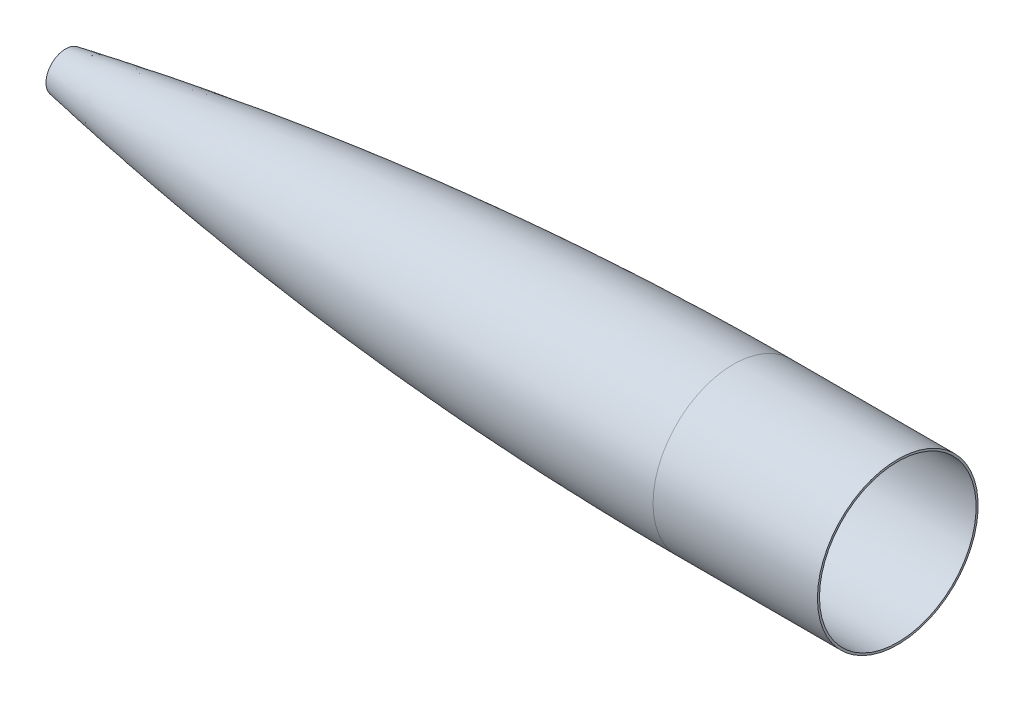
ISO-10303-21;
HEADER;
FILE_DESCRIPTION(('STEP AP214'),'2;1');
FILE_NAME('part.step','',(''),(''),'','','');
FILE_SCHEMA(('AUTOMOTIVE_DESIGN { 1 0 10303 214 1 1 1 1 }'));
ENDSEC;
DATA;
#1=APPLICATION_CONTEXT('core data for automotive mechanical design processes');
#2=APPLICATION_PROTOCOL_DEFINITION('international standard','automotive_design',2000,#1);
#3=PRODUCT_CONTEXT('',#1,'mechanical');
#4=PRODUCT('Part','Part','',(#3));
#5=PRODUCT_RELATED_PRODUCT_CATEGORY('part','',(#4));
#6=PRODUCT_DEFINITION_FORMATION('','',#4);
#7=PRODUCT_DEFINITION_CONTEXT('part definition',#1,'design');
#8=PRODUCT_DEFINITION('design','',#6,#7);
#9=PRODUCT_DEFINITION_SHAPE('','',#8);
#10=(LENGTH_UNIT() NAMED_UNIT(*) SI_UNIT(.MILLI.,.METRE.));
#11=(NAMED_UNIT(*) PLANE_ANGLE_UNIT() SI_UNIT($,.RADIAN.));
#12=(NAMED_UNIT(*) SI_UNIT($,.STERADIAN.) SOLID_ANGLE_UNIT());
#13=UNCERTAINTY_MEASURE_WITH_UNIT(LENGTH_MEASURE(1.E-05),#10,'distance_accuracy_value','');
#14=(GEOMETRIC_REPRESENTATION_CONTEXT(3) GLOBAL_UNCERTAINTY_ASSIGNED_CONTEXT((#13)) GLOBAL_UNIT_ASSIGNED_CONTEXT((#10,
#11,#12)) REPRESENTATION_CONTEXT('',''));
#15=CARTESIAN_POINT('',(0.,0.,0.));
#16=DIRECTION('',(0.,0.,1.));
#17=DIRECTION('',(1.,0.,0.));
#18=AXIS2_PLACEMENT_3D('',#15,#16,#17);
#19=CARTESIAN_POINT('',(749.94176676177,78.2000000001766,0.));
#20=CARTESIAN_POINT('',(749.013447521929,78.1990821646957,0.));
#21=CARTESIAN_POINT('',(747.142871411381,78.1963244631353,0.));
#22=CARTESIAN_POINT('',(743.144962511508,78.1882845770281,0.));
#23=CARTESIAN_POINT('',(738.792712605825,78.1730824819712,0.));
#24=CARTESIAN_POINT('',(734.382362932978,78.1523734655628,0.));
#25=CARTESIAN_POINT('',(729.905925646213,78.1261496546705,0.));
#26=CARTESIAN_POINT('',(725.461793245013,78.0945083632932,0.));
#27=CARTESIAN_POINT('',(721.009948114807,78.0574100665878,0.));
#28=CARTESIAN_POINT('',(717.103075526994,78.0200644610595,0.));
#29=CARTESIAN_POINT('',(713.74042464985,77.9844742097373,0.));
#30=CARTESIAN_POINT('',(710.353297221346,77.945829443464,0.));
#31=CARTESIAN_POINT('',(705.804444354857,77.8901355328951,0.));
#32=CARTESIAN_POINT('',(692.726759228616,77.7109242706275,0.));
#33=CARTESIAN_POINT('',(668.847358903374,77.2741042149261,0.));
#34=CARTESIAN_POINT('',(589.263170065417,75.1540746430687,0.));
#35=CARTESIAN_POINT('',(489.305434179286,69.6517508511253,0.));
#36=CARTESIAN_POINT('',(389.580060838768,60.8164215796509,0.));
#37=CARTESIAN_POINT('',(294.739285061992,49.2944245859872,0.));
#38=CARTESIAN_POINT('',(254.169064402329,43.7807815468403,0.));
#39=CARTESIAN_POINT('',(233.90294519789,40.8886698765213,0.));
#40=CARTESIAN_POINT('',(220.400428697888,38.9042715903934,0.));
#41=CARTESIAN_POINT('',(211.402067612572,37.5588123649427,0.));
#42=CARTESIAN_POINT('',(202.407139457551,36.1908454960505,0.));
#43=CARTESIAN_POINT('',(193.415599848764,34.8003611466702,0.));
#44=CARTESIAN_POINT('',(184.427673470814,33.387398792785,0.));
#45=CARTESIAN_POINT('',(175.443135341572,31.9519158863388,0.));
#46=CARTESIAN_POINT('',(166.462511860041,30.4940073264908,0.));
#47=CARTESIAN_POINT('',(157.485070561983,29.0135381195667,0.));
#48=CARTESIAN_POINT('',(148.512205564119,27.510762016555,0.));
#49=CARTESIAN_POINT('',(139.589972430126,25.9934811764236,0.));
#50=CARTESIAN_POINT('',(131.819133927516,24.6521565582264,0.));
#51=CARTESIAN_POINT('',(125.190409798549,23.4938734154169,0.));
#52=CARTESIAN_POINT('',(119.719521427806,22.5287764747113,0.));
#53=CARTESIAN_POINT('',(115.861710290932,21.8432102645428,0.));
#54=CARTESIAN_POINT('',(112.599803599681,21.2603041964968,0.));
#55=CARTESIAN_POINT('',(109.362490043085,20.6791222894646,0.));
#56=CARTESIAN_POINT('',(106.033221561676,20.0783671859564,0.));
#57=CARTESIAN_POINT('',(102.753257436666,19.4824668915702,0.));
#58=CARTESIAN_POINT('',(100.913198246995,19.1471478705529,0.));
#59=CARTESIAN_POINT('',(99.9999999999461,18.9802750382021,0.));
#60=B_SPLINE_CURVE_WITH_KNOTS('',4,(#19,#20,#21,#22,#23,#24,#25,#26,#27,#28,#29,#30,#31,#32,#33,
#34,#35,#36,#37,#38,#39,#40,#41,#42,#43,#44,#45,#46,#47,#48,#49,#50,#51,#52,#53,#54,#55,#56,#57,
#58,#59),.UNSPECIFIED.,.F.,.F.,(5,1,1,1,1,1,1,1,1,1,1,1,1,1,1,1,1,1,1,1,1,1,1,1,1,1,1,1,1,1,1,1,
1,1,1,1,1,5),(0.0827856324898364,0.0884676550262897,0.0941496775627431,0.0998317000991964,
0.10551372263565,0.111195745172103,0.116877767708556,0.12255979024501,0.128241812781463,
0.131145416719654,0.134049020657844,0.139856228534224,0.151470644286985,0.197928307106307,
0.256000385898297,0.546360778357468,0.662504935945017,0.7089625992743,0.743805846549275,
0.755420262183219,0.767034677817164,0.778649093451108,0.790263508968603,0.801877924486097,
0.813492340003591,0.825106755521085,0.836721171093262,0.848335586665439,0.859950002237616,
0.871564417809793,0.882928463715115,0.888610486667776,0.894292509620437,0.899974532573098,
0.902815544049428,0.905656555525759,0.91133857847842,0.917020601431081),.UNSPECIFIED.);
#61=CARTESIAN_POINT('',(0.,0.,0.));
#62=DIRECTION('',(-1.,0.,0.));
#63=AXIS1_PLACEMENT('',#61,#62);
#64=SURFACE_OF_REVOLUTION('',#60,#63);
#65=CARTESIAN_POINT('',(100.,0.,0.));
#66=DIRECTION('',(-1.,0.,0.));
#67=DIRECTION('',(0.,0.,1.));
#68=AXIS2_PLACEMENT_3D('',#65,#66,#67);
#69=CIRCLE('',#68,18.9802750382119);
#70=CARTESIAN_POINT('',(100.,0.,18.9802750382119));
#71=VERTEX_POINT('',#70);
#72=EDGE_CURVE('E10',#71,#71,#69,.T.);
#73=ORIENTED_EDGE('',*,*,#72,.F.);
#74=EDGE_LOOP('',(#73));
#75=FACE_BOUND('',#74,.T.);
#76=CARTESIAN_POINT('',(749.941766761772,0.,0.));
#77=DIRECTION('',(-1.,0.,0.));
#78=DIRECTION('',(0.,0.,1.));
#79=AXIS2_PLACEMENT_3D('',#76,#77,#78);
#80=CIRCLE('',#79,78.2000000001716);
#81=CARTESIAN_POINT('',(749.941766761772,0.,78.2000000001716));
#82=VERTEX_POINT('',#81);
#83=EDGE_CURVE('E50',#82,#82,#80,.T.);
#84=ORIENTED_EDGE('',*,*,#83,.T.);
#85=EDGE_LOOP('',(#84));
#86=FACE_BOUND('',#85,.T.);
#87=ADVANCED_FACE('F37',(#75,#86),#64,.T.);
#88=CARTESIAN_POINT('',(100.,18.9802750382119,0.));
#89=DIRECTION('',(1.,0.,0.));
#90=DIRECTION('',(0.,0.,-1.));
#91=AXIS2_PLACEMENT_3D('',#88,#89,#90);
#92=PLANE('',#91);
#93=ORIENTED_EDGE('',*,*,#72,.T.);
#94=EDGE_LOOP('',(#93));
#95=FACE_BOUND('',#94,.T.);
#96=ADVANCED_FACE('F39',(#95),#92,.F.);
#97=CARTESIAN_POINT('',(909.941766761772,78.2000000001716,0.));
#98=DIRECTION('',(-1.,0.,0.));
#99=DIRECTION('',(0.,0.,1.));
#100=AXIS2_PLACEMENT_3D('',#97,#98,#99);
#101=PLANE('',#100);
#102=CARTESIAN_POINT('',(909.941766761772,0.,0.));
#103=DIRECTION('',(-1.,0.,0.));
#104=DIRECTION('',(0.,0.,1.));
#105=AXIS2_PLACEMENT_3D('',#102,#103,#104);
#106=CIRCLE('',#105,76.2000000001716);
#107=CARTESIAN_POINT('',(909.941766761772,0.,76.2000000001716));
#108=VERTEX_POINT('',#107);
#109=EDGE_CURVE('E58',#108,#108,#106,.T.);
#110=ORIENTED_EDGE('',*,*,#109,.T.);
#111=EDGE_LOOP('',(#110));
#112=FACE_BOUND('',#111,.T.);
#113=CARTESIAN_POINT('',(909.941766761772,0.,0.));
#114=DIRECTION('',(-1.,0.,0.));
#115=DIRECTION('',(0.,0.,1.));
#116=AXIS2_PLACEMENT_3D('',#113,#114,#115);
#117=CIRCLE('',#116,78.2000000001716);
#118=CARTESIAN_POINT('',(909.941766761772,0.,78.2000000001716));
#119=VERTEX_POINT('',#118);
#120=EDGE_CURVE('E45',#119,#119,#117,.T.);
#121=ORIENTED_EDGE('',*,*,#120,.F.);
#122=EDGE_LOOP('',(#121));
#123=FACE_BOUND('',#122,.T.);
#124=ADVANCED_FACE('F89',(#112,#123),#101,.F.);
#125=CARTESIAN_POINT('',(0.,0.,0.));
#126=DIRECTION('',(-1.,0.,0.));
#127=DIRECTION('',(0.,0.,1.));
#128=AXIS2_PLACEMENT_3D('',#125,#126,#127);
#129=CYLINDRICAL_SURFACE('',#128,78.2000000001716);
#130=ORIENTED_EDGE('',*,*,#83,.F.);
#131=EDGE_LOOP('',(#130));
#132=FACE_BOUND('',#131,.T.);
#133=ORIENTED_EDGE('',*,*,#120,.T.);
#134=EDGE_LOOP('',(#133));
#135=FACE_BOUND('',#134,.T.);
#136=ADVANCED_FACE('F87',(#132,#135),#129,.T.);
#137=CARTESIAN_POINT('',(749.94176676177,78.2000000001766,0.));
#138=CARTESIAN_POINT('',(749.013447521929,78.1990821646957,0.));
#139=CARTESIAN_POINT('',(747.142871411381,78.1963244631353,0.));
#140=CARTESIAN_POINT('',(743.144962511508,78.1882845770281,0.));
#141=CARTESIAN_POINT('',(738.792712605825,78.1730824819712,0.));
#142=CARTESIAN_POINT('',(734.382362932978,78.1523734655628,0.));
#143=CARTESIAN_POINT('',(729.905925646213,78.1261496546705,0.));
#144=CARTESIAN_POINT('',(725.461793245013,78.0945083632932,0.));
#145=CARTESIAN_POINT('',(721.009948114807,78.0574100665878,0.));
#146=CARTESIAN_POINT('',(717.103075526994,78.0200644610595,0.));
#147=CARTESIAN_POINT('',(713.74042464985,77.9844742097373,0.));
#148=CARTESIAN_POINT('',(710.353297221346,77.945829443464,0.));
#149=CARTESIAN_POINT('',(705.804444354857,77.8901355328951,0.));
#150=CARTESIAN_POINT('',(692.726759228616,77.7109242706275,0.));
#151=CARTESIAN_POINT('',(668.847358903374,77.2741042149261,0.));
#152=CARTESIAN_POINT('',(589.263170065417,75.1540746430687,0.));
#153=CARTESIAN_POINT('',(489.305434179286,69.6517508511253,0.));
#154=CARTESIAN_POINT('',(389.580060838768,60.8164215796509,0.));
#155=CARTESIAN_POINT('',(294.739285061992,49.2944245859872,0.));
#156=CARTESIAN_POINT('',(254.169064402329,43.7807815468403,0.));
#157=CARTESIAN_POINT('',(233.90294519789,40.8886698765213,0.));
#158=CARTESIAN_POINT('',(220.400428697888,38.9042715903934,0.));
#159=CARTESIAN_POINT('',(211.402067612572,37.5588123649427,0.));
#160=CARTESIAN_POINT('',(202.407139457551,36.1908454960505,0.));
#161=CARTESIAN_POINT('',(193.415599848764,34.8003611466702,0.));
#162=CARTESIAN_POINT('',(184.427673470814,33.387398792785,0.));
#163=CARTESIAN_POINT('',(175.443135341572,31.9519158863388,0.));
#164=CARTESIAN_POINT('',(166.462511860041,30.4940073264908,0.));
#165=CARTESIAN_POINT('',(157.485070561983,29.0135381195667,0.));
#166=CARTESIAN_POINT('',(148.512205564119,27.510762016555,0.));
#167=CARTESIAN_POINT('',(139.589972430126,25.9934811764236,0.));
#168=CARTESIAN_POINT('',(131.819133927516,24.6521565582264,0.));
#169=CARTESIAN_POINT('',(125.190409798549,23.4938734154169,0.));
#170=CARTESIAN_POINT('',(119.719521427806,22.5287764747113,0.));
#171=CARTESIAN_POINT('',(115.861710290932,21.8432102645428,0.));
#172=CARTESIAN_POINT('',(112.599803599681,21.2603041964968,0.));
#173=CARTESIAN_POINT('',(109.362490043085,20.6791222894646,0.));
#174=CARTESIAN_POINT('',(106.033221561676,20.0783671859564,0.));
#175=CARTESIAN_POINT('',(102.753257436666,19.4824668915702,0.));
#176=CARTESIAN_POINT('',(100.913198246995,19.1471478705529,0.));
#177=CARTESIAN_POINT('',(99.9999999999461,18.9802750382021,0.));
#178=B_SPLINE_CURVE_WITH_KNOTS('',4,(#137,#138,#139,#140,#141,#142,#143,#144,#145,#146,#147,
#148,#149,#150,#151,#152,#153,#154,#155,#156,#157,#158,#159,#160,#161,#162,#163,#164,#165,#166,
#167,#168,#169,#170,#171,#172,#173,#174,#175,#176,#177),.UNSPECIFIED.,.F.,.F.,(5,1,1,1,1,1,1,1,
1,1,1,1,1,1,1,1,1,1,1,1,1,1,1,1,1,1,1,1,1,1,1,1,1,1,1,1,1,5),(0.0827856324898364,
0.0884676550262897,0.0941496775627431,0.0998317000991964,0.10551372263565,0.111195745172103,
0.116877767708556,0.12255979024501,0.128241812781463,0.131145416719654,0.134049020657844,
0.139856228534224,0.151470644286985,0.197928307106307,0.256000385898297,0.546360778357468,
0.662504935945017,0.7089625992743,0.743805846549275,0.755420262183219,0.767034677817164,
0.778649093451108,0.790263508968603,0.801877924486097,0.813492340003591,0.825106755521085,
0.836721171093262,0.848335586665439,0.859950002237616,0.871564417809793,0.882928463715115,
0.888610486667776,0.894292509620437,0.899974532573098,0.902815544049428,0.905656555525759,
0.91133857847842,0.917020601431081),.UNSPECIFIED.);
#179=CARTESIAN_POINT('',(0.,0.,0.));
#180=DIRECTION('',(-1.,0.,0.));
#181=AXIS1_PLACEMENT('',#179,#180);
#182=SURFACE_OF_REVOLUTION('',#178,#181);
#183=OFFSET_SURFACE('',#182,-2.,.F.);
#184=CARTESIAN_POINT('',(102.,0.,0.));
#185=DIRECTION('',(-1.,0.,0.));
#186=DIRECTION('',(0.,0.,1.));
#187=AXIS2_PLACEMENT_3D('',#184,#185,#186);
#188=CIRCLE('',#187,17.3121059492247);
#189=CARTESIAN_POINT('',(102.,0.,17.3121059492247));
#190=VERTEX_POINT('',#189);
#191=EDGE_CURVE('E55',#190,#190,#188,.T.);
#192=ORIENTED_EDGE('',*,*,#191,.T.);
#193=EDGE_LOOP('',(#192));
#194=FACE_BOUND('',#193,.T.);
#195=CARTESIAN_POINT('',(749.943744174252,0.,76.2000009777168));
#196=CARTESIAN_POINT('',(749.943744174248,-1.24682085944247,76.2000274258818));
#197=CARTESIAN_POINT('',(749.943744174252,-2.49363946840534,76.1694003622626));
#198=CARTESIAN_POINT('',(749.94374417426,-4.98427419494287,76.0470291164888));
#199=CARTESIAN_POINT('',(749.943744174264,-6.22809031251726,75.9552849343289));
#200=CARTESIAN_POINT('',(749.943744174262,-8.70972206545693,75.7108693565235));
#201=CARTESIAN_POINT('',(749.943744174256,-9.94753770082302,75.5581979608863));
#202=CARTESIAN_POINT('',(749.943744174251,-12.4141868929476,75.1923040920374));
#203=CARTESIAN_POINT('',(749.943744174251,-13.6430204497051,74.9790816188189));
#204=CARTESIAN_POINT('',(749.943744174253,-16.0887450069826,74.4925970325052));
#205=CARTESIAN_POINT('',(749.943744174254,-17.3056360075033,74.2193349194136));
#206=CARTESIAN_POINT('',(749.943744174245,-19.7245438848462,73.6134299642766));
#207=CARTESIAN_POINT('',(749.943744174234,-20.9265607616677,73.2807871222278));
#208=CARTESIAN_POINT('',(749.943744174241,-23.3128246196387,72.5569219145656));
#209=CARTESIAN_POINT('',(749.94374417426,-24.4970716007895,72.1656995489562));
#210=CARTESIAN_POINT('',(749.943744174267,-26.8449427149178,71.3256178260749));
#211=CARTESIAN_POINT('',(749.943744174254,-28.0085668478951,70.8767584688028));
#212=CARTESIAN_POINT('',(749.943744174251,-30.3123889927083,69.9224840925639));
#213=CARTESIAN_POINT('',(749.943744174261,-31.4525870045429,69.417069073594));
#214=CARTESIAN_POINT('',(749.943744174264,-33.7068100702395,68.3509009661327));
#215=CARTESIAN_POINT('',(749.943744174256,-34.8208351241023,67.790147877643));
#216=CARTESIAN_POINT('',(749.943744174252,-37.0200284899754,66.6146545335791));
#217=CARTESIAN_POINT('',(749.943744174255,-38.1051968019843,65.9999142780024));
#218=CARTESIAN_POINT('',(749.943744174258,-40.2440624185046,64.7179275631817));
#219=CARTESIAN_POINT('',(749.943744174258,-41.2977597230186,64.050681103942));
#220=CARTESIAN_POINT('',(749.94374417425,-43.3711448755897,62.6652894368227));
#221=CARTESIAN_POINT('',(749.943744174241,-44.390832723645,61.9471442289406));
#222=CARTESIAN_POINT('',(749.943744174239,-46.3937424458842,60.461685139305));
#223=CARTESIAN_POINT('',(749.943744174247,-47.3769643200688,59.6943712575525));
#224=CARTESIAN_POINT('',(749.943744174255,-49.3045734269817,58.1124233465018));
#225=CARTESIAN_POINT('',(749.943744174256,-50.2489606597097,57.2977893172032));
#226=CARTESIAN_POINT('',(749.943744174255,-52.0966253721614,55.6231636357765));
#227=CARTESIAN_POINT('',(749.943744174253,-52.9999028518843,54.7631719836474));
#228=CARTESIAN_POINT('',(749.943744174254,-54.7631719836911,52.9999028518377));
#229=CARTESIAN_POINT('',(749.943744174256,-55.6231636357773,52.0966253721592));
#230=CARTESIAN_POINT('',(749.943744174254,-57.2977893171771,50.2489606597398));
#231=CARTESIAN_POINT('',(749.943744174249,-58.1124233464889,49.3045734269971));
#232=CARTESIAN_POINT('',(749.943744174253,-59.6943712575528,47.3769643200688));
#233=CARTESIAN_POINT('',(749.943744174263,-60.461685139306,46.3937424458842));
#234=CARTESIAN_POINT('',(749.943744174264,-61.9471442289397,44.3908327236449));
#235=CARTESIAN_POINT('',(749.943744174256,-62.6652894368191,43.3711448755895));
#236=CARTESIAN_POINT('',(749.943744174252,-64.0506811039738,41.2977597229766));
#237=CARTESIAN_POINT('',(749.943744174256,-64.7179275632495,40.2440624184195));
#238=CARTESIAN_POINT('',(749.943744174256,-65.9999142780121,38.10519680194));
#239=CARTESIAN_POINT('',(749.943744174252,-66.6146545335012,37.020028490019));
#240=CARTESIAN_POINT('',(749.943744174246,-67.7901478776465,34.820835124198));
#241=CARTESIAN_POINT('',(749.943744174244,-68.3509009662986,33.7068100702958));
#242=CARTESIAN_POINT('',(749.943744174242,-69.4170690733824,31.452587004583));
#243=CARTESIAN_POINT('',(749.94374417424,-69.9224840918168,30.3123889927737));
#244=CARTESIAN_POINT('',(749.943744174265,-70.8767584694876,28.0085668479802));
#245=CARTESIAN_POINT('',(749.943744174291,-71.3256178287194,26.8449427149941));
#246=CARTESIAN_POINT('',(749.943744174282,-72.1656995463845,24.4970716005096));
#247=CARTESIAN_POINT('',(749.943744174246,-72.5569219048235,23.3128246190133));
#248=CARTESIAN_POINT('',(749.943744174228,-73.2807871320252,20.9265607621109));
#249=CARTESIAN_POINT('',(749.943744174245,-73.6134300007883,19.7245438867049));
#250=CARTESIAN_POINT('',(749.943744174254,-74.219334882844,17.3056360058755));
#251=CARTESIAN_POINT('',(749.943744174245,-74.4925968961348,16.0887450004517));
#252=CARTESIAN_POINT('',(749.943744174257,-74.9790817551222,13.6430204565728));
#253=CARTESIAN_POINT('',(749.943744174277,-75.1923046008155,12.4141869181172));
#254=CARTESIAN_POINT('',(749.943744174272,-75.5581974520735,9.94753767588742));
#255=CARTESIAN_POINT('',(749.943744174246,-75.7108674576392,8.70972197211339));
#256=CARTESIAN_POINT('',(749.943744174238,-75.9552868332303,6.22809040568706));
#257=CARTESIAN_POINT('',(749.943744174255,-76.0470362032562,4.98427454303481));
#258=CARTESIAN_POINT('',(749.943744174256,-76.1693932754981,2.49363912025494));
#259=CARTESIAN_POINT('',(749.943744174241,-76.2000009777168,1.24681956012744));
#260=CARTESIAN_POINT('',(749.943744174262,-76.2000009777168,-1.24681956012751));
#261=CARTESIAN_POINT('',(749.9437441743,-76.1693932754982,-2.49363912025497));
#262=CARTESIAN_POINT('',(749.943744174295,-76.0470362032533,-4.9842745430929));
#263=CARTESIAN_POINT('',(749.943744174253,-75.9552868332217,-6.2280904058031));
#264=CARTESIAN_POINT('',(749.943744174231,-75.7108674576249,-8.70972197222887));
#265=CARTESIAN_POINT('',(749.94374417425,-75.5581974520649,-9.94753767594495));
#266=CARTESIAN_POINT('',(749.943744174257,-75.1923046008236,-12.4141869180627));
#267=CARTESIAN_POINT('',(749.943744174243,-74.9790817551411,-13.6430204564642));
#268=CARTESIAN_POINT('',(749.94374417426,-74.4925968961709,-16.0887450002842));
#269=CARTESIAN_POINT('',(749.94374417429,-74.2193348828842,-17.305636005703));
#270=CARTESIAN_POINT('',(749.943744174295,-73.6134300008219,-19.7245438865832));
#271=CARTESIAN_POINT('',(749.94374417427,-73.2807871320452,-20.9265607620443));
#272=CARTESIAN_POINT('',(749.943744174245,-72.5569219048101,-23.3128246190585));
#273=CARTESIAN_POINT('',(749.943744174245,-72.165699546351,-24.4970716006114));
#274=CARTESIAN_POINT('',(749.943744174242,-71.3256178286831,-26.8449427150874));
#275=CARTESIAN_POINT('',(749.943744174239,-70.8767584694744,-28.0085668480105));
#276=CARTESIAN_POINT('',(749.943744174266,-69.922484091826,-30.312388992753));
#277=CARTESIAN_POINT('',(749.943744174295,-69.4170690733872,-31.4525870045728));
#278=CARTESIAN_POINT('',(749.943744174294,-68.350900966321,-33.7068100702487));
#279=CARTESIAN_POINT('',(749.943744174265,-67.7901478776935,-34.8208351241048));
#280=CARTESIAN_POINT('',(749.943744174243,-66.6146545335526,-37.0200284899282));
#281=CARTESIAN_POINT('',(749.943744174251,-65.9999142780389,-38.1051968018953));
#282=CARTESIAN_POINT('',(749.943744174251,-64.7179275632495,-40.2440624184195));
#283=CARTESIAN_POINT('',(749.943744174243,-64.0506811039738,-41.2977597229766));
#284=CARTESIAN_POINT('',(749.943744174264,-62.6652894368455,-43.37114487555));
#285=CARTESIAN_POINT('',(749.943744174293,-61.9471442289945,-44.3908327235673));
#286=CARTESIAN_POINT('',(749.943744174292,-60.4616851393757,-46.3937424457943));
#287=CARTESIAN_POINT('',(749.943744174264,-59.694371257606,-47.3769643200025));
#288=CARTESIAN_POINT('',(749.943744174238,-58.1124233465399,-49.3045734269364));
#289=CARTESIAN_POINT('',(749.943744174241,-57.2977893172443,-50.2489606596626));
#290=CARTESIAN_POINT('',(749.943744174254,-55.6231636358209,-52.0966253721142));
#291=CARTESIAN_POINT('',(749.943744174264,-54.7631719836918,-52.9999028518385));
#292=CARTESIAN_POINT('',(749.943744174286,-52.9999028518539,-54.7631719836763));
#293=CARTESIAN_POINT('',(749.943744174299,-52.0966253721459,-55.6231636357907));
#294=CARTESIAN_POINT('',(749.943744174285,-50.2489606597097,-57.2977893172031));
#295=CARTESIAN_POINT('',(749.943744174259,-49.3045734269817,-58.1124233465015));
#296=CARTESIAN_POINT('',(749.943744174243,-47.3769643201056,-59.6943712575226));
#297=CARTESIAN_POINT('',(749.943744174253,-46.3937424459592,-60.4616851392475));
#298=CARTESIAN_POINT('',(749.943744174261,-44.39083272367,-61.947144228924));
#299=CARTESIAN_POINT('',(749.943744174258,-43.3711448755216,-62.6652894368683));
#300=CARTESIAN_POINT('',(749.943744174272,-41.2977597228657,-64.0506811040441));
#301=CARTESIAN_POINT('',(749.943744174288,-40.2440624183632,-64.7179275632833));
#302=CARTESIAN_POINT('',(749.943744174281,-38.1051968019401,-65.9999142780121));
#303=CARTESIAN_POINT('',(749.943744174258,-37.020028490019,-66.6146545335012));
#304=CARTESIAN_POINT('',(749.943744174249,-34.8208351242092,-67.7901478776406));
#305=CARTESIAN_POINT('',(749.943744174263,-33.7068100703184,-68.3509009662873));
#306=CARTESIAN_POINT('',(749.94374417427,-31.452587004555,-69.4170690733963));
#307=CARTESIAN_POINT('',(749.943744174263,-30.3123889926819,-69.9224840918579));
#308=CARTESIAN_POINT('',(749.943744174283,-28.0085668479315,-70.8767584695048));
#309=CARTESIAN_POINT('',(749.943744174311,-26.8449427150558,-71.3256178286942));
#310=CARTESIAN_POINT('',(749.943744174306,-24.4970716006314,-72.1656995463442));
#311=CARTESIAN_POINT('',(749.943744174273,-23.3128246190819,-72.5569219048025));
#312=CARTESIAN_POINT('',(749.943744174242,-20.9265607620863,-73.2807871320329));
#313=CARTESIAN_POINT('',(749.943744174243,-19.7245438866406,-73.6134300008062));
#314=CARTESIAN_POINT('',(749.943744174253,-17.3056360057225,-74.2193348828805));
#315=CARTESIAN_POINT('',(749.943744174262,-16.0887450002496,-74.4925968961793));
#316=CARTESIAN_POINT('',(749.943744174284,-13.6430204563257,-74.9790817551672));
#317=CARTESIAN_POINT('',(749.943744174298,-12.4141869178745,-75.1923046008555));
#318=CARTESIAN_POINT('',(749.943744174293,-9.94753767577202,-75.5581974520866));
#319=CARTESIAN_POINT('',(749.943744174275,-8.70972197212171,-75.7108674576362));
#320=CARTESIAN_POINT('',(749.943744174251,-6.22809040576843,-75.9552868332244));
#321=CARTESIAN_POINT('',(749.943744174245,-4.98427454306466,-76.047036203255));
#322=CARTESIAN_POINT('',(749.943744174266,-2.49363912024041,-76.1693932754985));
#323=CARTESIAN_POINT('',(749.943744174293,-1.2468195601202,-76.2000009777169));
#324=CARTESIAN_POINT('',(749.943744174293,1.2468195601203,-76.2000009777169));
#325=CARTESIAN_POINT('',(749.943744174266,2.4936391202406,-76.1693932754985));
#326=CARTESIAN_POINT('',(749.943744174245,4.98427454306485,-76.047036203255));
#327=CARTESIAN_POINT('',(749.943744174251,6.22809040576853,-75.9552868332244));
#328=CARTESIAN_POINT('',(749.943744174275,8.70972197217887,-75.7108674576305));
#329=CARTESIAN_POINT('',(749.943744174292,9.94753767588607,-75.5581974520725));
#330=CARTESIAN_POINT('',(749.943744174299,12.4141869179877,-75.1923046008359));
#331=CARTESIAN_POINT('',(749.943744174288,13.643020456382,-74.979081755156));
#332=CARTESIAN_POINT('',(749.943744174258,16.0887450002461,-74.49259689618));
#333=CARTESIAN_POINT('',(749.943744174239,17.3056360057155,-74.2193348828821));
#334=CARTESIAN_POINT('',(749.94374417426,19.7245438866337,-73.6134300008082));
#335=CARTESIAN_POINT('',(749.943744174299,20.9265607620829,-73.280787132034));
#336=CARTESIAN_POINT('',(749.943744174303,23.3128246190867,-72.5569219048011));
#337=CARTESIAN_POINT('',(749.943744174267,24.4970716006409,-72.165699546341));
#338=CARTESIAN_POINT('',(749.943744174262,26.8449427151165,-71.3256178286721));
#339=CARTESIAN_POINT('',(749.943744174292,28.0085668480381,-70.8767584694635));
#340=CARTESIAN_POINT('',(749.943744174302,30.3123889927729,-69.9224840918173));
#341=CARTESIAN_POINT('',(749.943744174281,31.4525870045866,-69.4170690733809));
#342=CARTESIAN_POINT('',(749.943744174251,33.706810070238,-68.3509009663259));
#343=CARTESIAN_POINT('',(749.943744174243,34.820835124076,-67.7901478777079));
#344=CARTESIAN_POINT('',(749.943744174255,37.0200284899201,-66.6146545335579));
#345=CARTESIAN_POINT('',(749.943744174277,38.1051968019246,-65.9999142780229));
#346=CARTESIAN_POINT('',(749.943744174292,40.2440624184344,-64.7179275632392));
#347=CARTESIAN_POINT('',(749.943744174286,41.2977597229422,-64.0506811039949));
#348=CARTESIAN_POINT('',(749.943744174268,43.3711448755459,-62.6652894368502));
#349=CARTESIAN_POINT('',(749.943744174257,44.3908327236387,-61.9471442289451));
#350=CARTESIAN_POINT('',(749.94374417427,46.3937424458919,-60.4616851392996));
#351=CARTESIAN_POINT('',(749.943744174295,47.3769643200553,-59.694371257563));
#352=CARTESIAN_POINT('',(749.943744174295,49.3045734269611,-58.1124233465194));
#353=CARTESIAN_POINT('',(749.943744174272,50.2489606597019,-57.2977893172103));
#354=CARTESIAN_POINT('',(749.943744174267,52.0966253721334,-55.6231636358019));
#355=CARTESIAN_POINT('',(749.943744174286,52.9999028518251,-54.7631719837037));
#356=CARTESIAN_POINT('',(749.943744174294,54.7631719836601,-52.9999028518717));
#357=CARTESIAN_POINT('',(749.943744174282,55.6231636358012,-52.0966253721357));
#358=CARTESIAN_POINT('',(749.943744174257,57.2977893172362,-50.2489606596718));
#359=CARTESIAN_POINT('',(749.943744174244,58.1124233465319,-49.3045734269457));
#360=CARTESIAN_POINT('',(749.943744174258,59.6943712575742,-47.3769643200416));
#361=CARTESIAN_POINT('',(749.943744174285,60.4616851393213,-46.3937424458641));
#362=CARTESIAN_POINT('',(749.9437441743,61.9471442289655,-44.3908327236098));
#363=CARTESIAN_POINT('',(749.94374417429,62.66528943686,-43.3711448755313));
#364=CARTESIAN_POINT('',(749.943744174264,64.0506811040062,-41.2977597229253));
#365=CARTESIAN_POINT('',(749.943744174248,64.7179275632609,-40.2440624184));
#366=CARTESIAN_POINT('',(749.943744174264,65.9999142780357,-38.1051968019011));
#367=CARTESIAN_POINT('',(749.943744174295,66.6146545335538,-37.0200284899265));
#368=CARTESIAN_POINT('',(749.943744174296,67.7901478776894,-34.8208351241121));
#369=CARTESIAN_POINT('',(749.943744174267,68.3509009663085,-33.7068100702732));
#370=CARTESIAN_POINT('',(749.943744174266,69.4170690733658,-31.4525870046199));
#371=CARTESIAN_POINT('',(749.943744174294,69.9224840918033,-30.3123889928052));
#372=CARTESIAN_POINT('',(749.9437441743,70.8767584694516,-28.0085668480684));
#373=CARTESIAN_POINT('',(749.943744174278,71.3256178286612,-26.8449427151457));
#374=CARTESIAN_POINT('',(749.943744174252,72.1656995463319,-24.4970716006678));
#375=CARTESIAN_POINT('',(749.943744174249,72.5569219047928,-23.3128246191125));
#376=CARTESIAN_POINT('',(749.943744174267,73.2807871320252,-20.9265607621132));
#377=CARTESIAN_POINT('',(749.943744174288,73.6134300007984,-19.7245438866697));
#378=CARTESIAN_POINT('',(749.943744174297,74.2193348828737,-17.305636005752));
#379=CARTESIAN_POINT('',(749.943744174284,74.4925968961735,-16.0887450002771));
#380=CARTESIAN_POINT('',(749.94374417426,74.9790817551627,-13.6430204563502));
#381=CARTESIAN_POINT('',(749.94374417425,75.1923046008516,-12.414186917898));
#382=CARTESIAN_POINT('',(749.943744174258,75.5581974520839,-9.94753767579245));
#383=CARTESIAN_POINT('',(749.943744174276,75.7108674576341,-8.70972197214003));
#384=CARTESIAN_POINT('',(749.943744174292,75.9552868332234,-6.22809040578186));
#385=CARTESIAN_POINT('',(749.943744174288,76.0470362032544,-4.98427454307532));
#386=CARTESIAN_POINT('',(749.943744174264,76.1693932754984,-2.49363912024567));
#387=CARTESIAN_POINT('',(749.943744174243,76.2000009777168,-1.24681956012284));
#388=CARTESIAN_POINT('',(749.94374417426,76.2000009777168,1.24681956012284));
#389=CARTESIAN_POINT('',(749.943744174299,76.1693932754984,2.49363912024568));
#390=CARTESIAN_POINT('',(749.943744174296,76.0470362032573,4.98427454301657));
#391=CARTESIAN_POINT('',(749.943744174256,75.9552868332321,6.22809040566448));
#392=CARTESIAN_POINT('',(749.943744174229,75.7108674576485,8.70972197202321));
#393=CARTESIAN_POINT('',(749.943744174241,75.5581974520926,9.94753767573427));
#394=CARTESIAN_POINT('',(749.943744174266,75.1923046008516,12.4141869178981));
#395=CARTESIAN_POINT('',(749.943744174277,74.9790817551627,13.6430204563502));
#396=CARTESIAN_POINT('',(749.943744174268,74.4925968961839,16.0887450002243));
#397=CARTESIAN_POINT('',(749.943744174248,74.2193348828973,17.3056360056469));
#398=CARTESIAN_POINT('',(749.943744174251,73.6134300008261,19.7245438865701));
#399=CARTESIAN_POINT('',(749.943744174274,73.2807871320386,20.9265607620699));
#400=CARTESIAN_POINT('',(749.943744174287,72.5569219047901,23.3128246191206));
#401=CARTESIAN_POINT('',(749.943744174276,72.1656995463305,24.4970716006719));
#402=CARTESIAN_POINT('',(749.943744174253,71.3256178286776,26.8449427150996));
#403=CARTESIAN_POINT('',(749.94374417424,70.8767584694868,28.0085668479769));
#404=CARTESIAN_POINT('',(749.943744174261,69.922484091843,30.3123889927157));
#405=CARTESIAN_POINT('',(749.943744174294,69.4170690733867,31.4525870045757));
#406=CARTESIAN_POINT('',(749.943744174295,68.3509009663086,33.7068100702732));
#407=CARTESIAN_POINT('',(749.943744174261,67.7901478776894,34.8208351241121));
#408=CARTESIAN_POINT('',(749.943744174237,66.6146545335537,37.0200284899264));
#409=CARTESIAN_POINT('',(749.943744174245,65.9999142780357,38.1051968019011));
#410=CARTESIAN_POINT('',(749.943744174267,64.7179275632609,40.2440624184));
#411=CARTESIAN_POINT('',(749.94374417428,64.0506811040062,41.2977597229253));
#412=CARTESIAN_POINT('',(749.943744174273,62.6652894368599,43.3711448755313));
#413=CARTESIAN_POINT('',(749.943744174253,61.9471442289654,44.3908327236099));
#414=CARTESIAN_POINT('',(749.943744174261,60.4616851393076,46.3937424458825));
#415=CARTESIAN_POINT('',(749.94374417429,59.694371257546,47.3769643200777));
#416=CARTESIAN_POINT('',(749.9437441743,58.1124233464882,49.3045734269974));
#417=CARTESIAN_POINT('',(749.943744174283,57.2977893171922,50.248960659722));
#418=CARTESIAN_POINT('',(749.943744174256,55.623163635785,52.0966253721519));
#419=CARTESIAN_POINT('',(749.943744174246,54.7631719836734,52.9999028518568));
#420=CARTESIAN_POINT('',(749.94374417426,52.9999028518709,54.7631719836593));
#421=CARTESIAN_POINT('',(749.943744174283,52.0966253721808,55.6231636357575));
#422=CARTESIAN_POINT('',(749.943744174286,50.2489606597522,57.2977893171663));
#423=CARTESIAN_POINT('',(749.943744174265,49.3045734270128,58.1124233464758));
#424=CARTESIAN_POINT('',(749.943744174237,47.3769643200913,59.6943712575346));
#425=CARTESIAN_POINT('',(749.94374417423,46.3937424459101,60.461685139285));
#426=CARTESIAN_POINT('',(749.94374417425,44.3908327236387,61.9471442289461));
#427=CARTESIAN_POINT('',(749.943744174276,43.3711448755461,62.6652894368538));
#428=CARTESIAN_POINT('',(749.943744174278,41.2977597229421,64.0506811039913));
#429=CARTESIAN_POINT('',(749.943744174253,40.2440624184337,64.7179275632257));
#430=CARTESIAN_POINT('',(749.943744174259,38.1051968019252,65.9999142780364));
#431=CARTESIAN_POINT('',(749.943744174289,37.0200284899226,66.6146545336084));
#432=CARTESIAN_POINT('',(749.943744174303,34.8208351240735,67.7901478776574));
#433=CARTESIAN_POINT('',(749.943744174286,33.7068100702288,68.3509009661376));
#434=CARTESIAN_POINT('',(749.943744174255,31.4525870045515,69.4170690735901));
#435=CARTESIAN_POINT('',(749.94374417424,30.3123889927177,69.9224840925598));
#436=CARTESIAN_POINT('',(749.943744174265,28.0085668479588,70.8767584687766));
#437=CARTESIAN_POINT('',(749.943744174306,26.8449427150361,71.3256178260294));
#438=CARTESIAN_POINT('',(749.943744174311,24.49707160087,72.1656995489306));
#439=CARTESIAN_POINT('',(749.943744174275,23.3128246196241,72.556921914572));
#440=CARTESIAN_POINT('',(749.94374417424,20.9265607616137,73.2807871222423));
#441=CARTESIAN_POINT('',(749.943744174241,19.7245438848501,73.6134299642745));
#442=CARTESIAN_POINT('',(749.943744174258,17.3056360075172,74.2193349194112));
#443=CARTESIAN_POINT('',(749.943744174274,16.0887450069474,74.4925970325137));
#444=CARTESIAN_POINT('',(749.943744174271,13.6430204496856,74.9790816188213));
#445=CARTESIAN_POINT('',(749.943744174252,12.4141868929939,75.1923040920286));
#446=CARTESIAN_POINT('',(749.943744174255,9.94753770088436,75.5581979608791));
#447=CARTESIAN_POINT('',(749.943744174277,8.70972206546657,75.7108693565233));
#448=CARTESIAN_POINT('',(749.943744174292,6.22809031248186,75.9552849343317));
#449=CARTESIAN_POINT('',(749.943744174285,4.98427419491442,76.0470291164906));
#450=CARTESIAN_POINT('',(749.943744174267,2.493639468391,76.1694003622629));
#451=CARTESIAN_POINT('',(749.943744174255,1.2468208594353,76.2000274258818));
#452=CARTESIAN_POINT('',(749.943744174252,0.,76.2000009777168));
#453=B_SPLINE_CURVE_WITH_KNOTS('',3,(#195,#196,#197,#198,#199,#200,#201,#202,#203,#204,#205,
#206,#207,#208,#209,#210,#211,#212,#213,#214,#215,#216,#217,#218,#219,#220,#221,#222,#223,#224,
#225,#226,#227,#228,#229,#230,#231,#232,#233,#234,#235,#236,#237,#238,#239,#240,#241,#242,#243,
#244,#245,#246,#247,#248,#249,#250,#251,#252,#253,#254,#255,#256,#257,#258,#259,#260,#261,#262,
#263,#264,#265,#266,#267,#268,#269,#270,#271,#272,#273,#274,#275,#276,#277,#278,#279,#280,#281,
#282,#283,#284,#285,#286,#287,#288,#289,#290,#291,#292,#293,#294,#295,#296,#297,#298,#299,#300,
#301,#302,#303,#304,#305,#306,#307,#308,#309,#310,#311,#312,#313,#314,#315,#316,#317,#318,#319,
#320,#321,#322,#323,#324,#325,#326,#327,#328,#329,#330,#331,#332,#333,#334,#335,#336,#337,#338,
#339,#340,#341,#342,#343,#344,#345,#346,#347,#348,#349,#350,#351,#352,#353,#354,#355,#356,#357,
#358,#359,#360,#361,#362,#363,#364,#365,#366,#367,#368,#369,#370,#371,#372,#373,#374,#375,#376,
#377,#378,#379,#380,#381,#382,#383,#384,#385,#386,#387,#388,#389,#390,#391,#392,#393,#394,#395,
#396,#397,#398,#399,#400,#401,#402,#403,#404,#405,#406,#407,#408,#409,#410,#411,#412,#413,#414,
#415,#416,#417,#418,#419,#420,#421,#422,#423,#424,#425,#426,#427,#428,#429,#430,#431,#432,#433,
#434,#435,#436,#437,#438,#439,#440,#441,#442,#443,#444,#445,#446,#447,#448,#449,#450,#451,#452),
.UNSPECIFIED.,.F.,.F.,(4,2,2,2,2,2,2,2,2,2,2,2,2,2,2,2,2,2,2,2,2,2,2,2,2,2,2,2,2,2,2,2,2,2,2,2,
2,2,2,2,2,2,2,2,2,2,2,2,2,2,2,2,2,2,2,2,2,2,2,2,2,2,2,2,2,2,2,2,2,2,2,2,2,2,2,2,2,2,2,2,2,2,2,2,
2,2,2,2,2,2,2,2,2,2,2,2,2,2,2,2,2,2,2,2,2,2,2,2,2,2,2,2,2,2,2,2,2,2,2,2,2,2,2,2,2,2,2,2,4),(0.,
3.74008327477501,7.48016654988649,11.2202498244963,14.9603330995294,18.7004163743474,
22.4404996493761,26.1805829241432,29.9206661989309,33.6607494739195,37.400832748782,
41.1409160238233,44.8809992985606,48.6210825734806,52.3611658483212,56.1012491231911,
59.841332398152,63.5814156729277,67.3214989478572,71.061582222698,74.8016654976178,
78.5417487725074,82.28183204724,86.0219153222589,89.7619985970837,93.5020818722024,
97.2421651469463,100.982248421659,104.722331696479,108.462414971503,112.202498246467,
115.942581521403,119.682664796178,123.422748070953,127.162831346064,130.902914620854,
134.642997895712,138.383081170515,142.123164445398,145.863247720322,149.603330995239,
153.343414270098,157.08349754496,160.82358081985,164.563664094739,168.303747369516,
172.043830644443,175.783913919304,179.523997194268,183.264080469166,187.004163744036,
190.744247018734,194.484330293993,198.224413568686,201.964496843418,205.704580118399,
209.444663393432,213.184746668196,216.92482994311,220.664913217945,224.404996492914,
228.145079767922,231.885163042513,235.625246317604,239.365329592357,243.10541286711,
246.845496142201,250.585579416964,254.3256626918,258.065745966758,261.805829241604,
265.545912516533,269.285995791446,273.026079066285,276.766162341086,280.506245616104,
284.246328890819,287.986412165874,291.726495440634,295.466578715554,299.206661990383,
302.946745265398,306.686828540258,310.426911815071,314.166995090073,317.907078364849,
321.647161639764,325.387244914569,329.127328189412,332.86741146433,336.607494739262,
340.347578014091,344.087661289066,347.827744564078,351.567827838675,355.307911113774,
359.047994388535,362.788077663296,366.528160938219,370.268244212993,374.008327488004,
377.748410762818,381.488494037821,385.228577312741,388.968660587511,392.708743862501,
396.448827137306,400.188910412222,403.928993686997,407.669076962,411.409160236881,
415.149243511739,418.889326786624,422.629410061451,426.369493336368,430.109576611196,
433.849659886252,437.589743160966,441.329826435984,445.069909710785,448.809992985772,
452.550076260386,456.290159535454,460.030242810302,463.770326085271,467.510409360104,
471.25049263487,474.99057590996,478.730659184714),.UNSPECIFIED.);
#454=CARTESIAN_POINT('',(749.943744174252,0.,76.2000009777168));
#455=VERTEX_POINT('',#454);
#456=EDGE_CURVE('E62',#455,#455,#453,.F.);
#457=ORIENTED_EDGE('',*,*,#456,.F.);
#458=EDGE_LOOP('',(#457));
#459=FACE_BOUND('',#458,.T.);
#460=ADVANCED_FACE('F81',(#194,#459),#183,.F.);
#461=CARTESIAN_POINT('',(102.,18.9802750382119,0.));
#462=DIRECTION('',(1.,0.,0.));
#463=DIRECTION('',(0.,0.,-1.));
#464=AXIS2_PLACEMENT_3D('',#461,#462,#463);
#465=PLANE('',#464);
#466=ORIENTED_EDGE('',*,*,#191,.F.);
#467=EDGE_LOOP('',(#466));
#468=FACE_BOUND('',#467,.T.);
#469=ADVANCED_FACE('F79',(#468),#465,.T.);
#470=CARTESIAN_POINT('',(0.,0.,0.));
#471=DIRECTION('',(-1.,0.,0.));
#472=DIRECTION('',(0.,0.,1.));
#473=AXIS2_PLACEMENT_3D('',#470,#471,#472);
#474=CYLINDRICAL_SURFACE('',#473,76.2000000001716);
#475=ORIENTED_EDGE('',*,*,#456,.T.);
#476=EDGE_LOOP('',(#475));
#477=FACE_BOUND('',#476,.T.);
#478=ORIENTED_EDGE('',*,*,#109,.F.);
#479=EDGE_LOOP('',(#478));
#480=FACE_BOUND('',#479,.T.);
#481=ADVANCED_FACE('F69',(#477,#480),#474,.F.);
#482=CLOSED_SHELL('',(#87,#96,#124,#136,#460,#469,#481));
#483=MANIFOLD_SOLID_BREP('B2',#482);
#484=ADVANCED_BREP_SHAPE_REPRESENTATION('',(#18,#483),#14);
#485=SHAPE_DEFINITION_REPRESENTATION(#9,#484);
ENDSEC;
END-ISO-10303-21;
